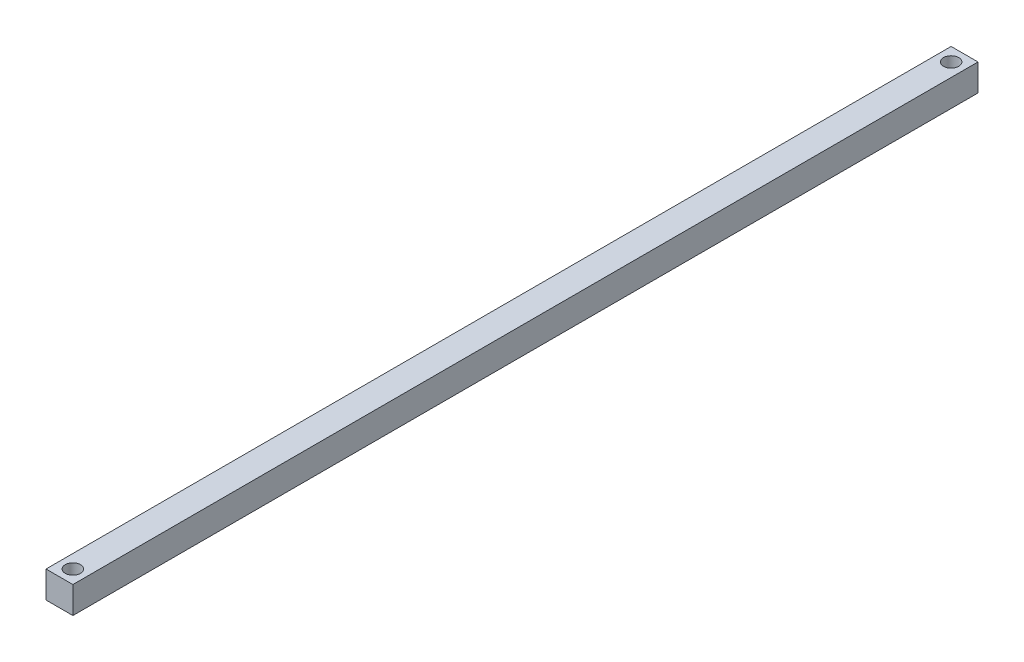
ISO-10303-21;
HEADER;
FILE_DESCRIPTION(('STEP AP214'),'2;1');
FILE_NAME('part.step','',(''),(''),'','','');
FILE_SCHEMA(('AUTOMOTIVE_DESIGN { 1 0 10303 214 1 1 1 1 }'));
ENDSEC;
DATA;
#1=APPLICATION_CONTEXT('core data for automotive mechanical design processes');
#2=APPLICATION_PROTOCOL_DEFINITION('international standard','automotive_design',2000,#1);
#3=PRODUCT_CONTEXT('',#1,'mechanical');
#4=PRODUCT('Part','Part','',(#3));
#5=PRODUCT_RELATED_PRODUCT_CATEGORY('part','',(#4));
#6=PRODUCT_DEFINITION_FORMATION('','',#4);
#7=PRODUCT_DEFINITION_CONTEXT('part definition',#1,'design');
#8=PRODUCT_DEFINITION('design','',#6,#7);
#9=PRODUCT_DEFINITION_SHAPE('','',#8);
#10=(LENGTH_UNIT() NAMED_UNIT(*) SI_UNIT(.MILLI.,.METRE.));
#11=(NAMED_UNIT(*) PLANE_ANGLE_UNIT() SI_UNIT($,.RADIAN.));
#12=(NAMED_UNIT(*) SI_UNIT($,.STERADIAN.) SOLID_ANGLE_UNIT());
#13=UNCERTAINTY_MEASURE_WITH_UNIT(LENGTH_MEASURE(1.E-05),#10,'distance_accuracy_value','');
#14=(GEOMETRIC_REPRESENTATION_CONTEXT(3) GLOBAL_UNCERTAINTY_ASSIGNED_CONTEXT((#13)) GLOBAL_UNIT_ASSIGNED_CONTEXT((#10,
#11,#12)) REPRESENTATION_CONTEXT('',''));
#15=CARTESIAN_POINT('',(0.,0.,0.));
#16=DIRECTION('',(0.,0.,1.));
#17=DIRECTION('',(1.,0.,0.));
#18=AXIS2_PLACEMENT_3D('',#15,#16,#17);
#19=CARTESIAN_POINT('',(7.5,-7.5,252.5));
#20=DIRECTION('',(-1.,0.,0.));
#21=DIRECTION('',(0.,0.,1.));
#22=AXIS2_PLACEMENT_3D('',#19,#20,#21);
#23=PLANE('',#22);
#24=DIRECTION('',(0.,1.,0.));
#25=VECTOR('',#24,1.);
#26=CARTESIAN_POINT('',(7.5,-7.5,-252.5));
#27=LINE('',#26,#25);
#28=CARTESIAN_POINT('',(7.5,-7.5,-252.5));
#29=VERTEX_POINT('',#28);
#30=CARTESIAN_POINT('',(7.5,7.5,-252.5));
#31=VERTEX_POINT('',#30);
#32=EDGE_CURVE('E99',#29,#31,#27,.T.);
#33=ORIENTED_EDGE('',*,*,#32,.T.);
#34=DIRECTION('',(0.,0.,-1.));
#35=VECTOR('',#34,1.);
#36=CARTESIAN_POINT('',(7.5,7.5,252.5));
#37=LINE('',#36,#35);
#38=CARTESIAN_POINT('',(7.5,7.5,252.5));
#39=VERTEX_POINT('',#38);
#40=EDGE_CURVE('E11',#39,#31,#37,.T.);
#41=ORIENTED_EDGE('',*,*,#40,.F.);
#42=DIRECTION('',(0.,1.,0.));
#43=VECTOR('',#42,1.);
#44=CARTESIAN_POINT('',(7.5,-7.5,252.5));
#45=LINE('',#44,#43);
#46=CARTESIAN_POINT('',(7.5,-7.5,252.5));
#47=VERTEX_POINT('',#46);
#48=EDGE_CURVE('E87',#47,#39,#45,.T.);
#49=ORIENTED_EDGE('',*,*,#48,.F.);
#50=DIRECTION('',(0.,0.,-1.));
#51=VECTOR('',#50,1.);
#52=CARTESIAN_POINT('',(7.5,-7.5,252.5));
#53=LINE('',#52,#51);
#54=EDGE_CURVE('E95',#47,#29,#53,.T.);
#55=ORIENTED_EDGE('',*,*,#54,.T.);
#56=EDGE_LOOP('',(#33,#41,#49,#55));
#57=FACE_BOUND('',#56,.T.);
#58=ADVANCED_FACE('F36',(#57),#23,.F.);
#59=CARTESIAN_POINT('',(-7.5,7.5,252.5));
#60=DIRECTION('',(0.,-1.,0.));
#61=DIRECTION('',(0.,0.,-1.));
#62=AXIS2_PLACEMENT_3D('',#59,#60,#61);
#63=PLANE('',#62);
#64=CARTESIAN_POINT('',(0.,7.5,245.));
#65=DIRECTION('',(0.,-1.,0.));
#66=DIRECTION('',(0.,0.,-1.));
#67=AXIS2_PLACEMENT_3D('',#64,#65,#66);
#68=CIRCLE('',#67,4.25000000000001);
#69=CARTESIAN_POINT('',(0.,7.5,240.75));
#70=VERTEX_POINT('',#69);
#71=EDGE_CURVE('E124',#70,#70,#68,.T.);
#72=ORIENTED_EDGE('',*,*,#71,.T.);
#73=EDGE_LOOP('',(#72));
#74=FACE_BOUND('',#73,.T.);
#75=CARTESIAN_POINT('',(0.,7.5,-245.));
#76=DIRECTION('',(0.,-1.,0.));
#77=DIRECTION('',(0.,0.,-1.));
#78=AXIS2_PLACEMENT_3D('',#75,#76,#77);
#79=CIRCLE('',#78,4.25000000000001);
#80=CARTESIAN_POINT('',(0.,7.5,-249.25));
#81=VERTEX_POINT('',#80);
#82=EDGE_CURVE('E102',#81,#81,#79,.T.);
#83=ORIENTED_EDGE('',*,*,#82,.T.);
#84=EDGE_LOOP('',(#83));
#85=FACE_BOUND('',#84,.T.);
#86=DIRECTION('',(-1.,0.,0.));
#87=VECTOR('',#86,1.);
#88=CARTESIAN_POINT('',(-7.5,7.5,-252.5));
#89=LINE('',#88,#87);
#90=CARTESIAN_POINT('',(-7.5,7.5,-252.5));
#91=VERTEX_POINT('',#90);
#92=EDGE_CURVE('E91',#31,#91,#89,.T.);
#93=ORIENTED_EDGE('',*,*,#92,.T.);
#94=DIRECTION('',(0.,0.,-1.));
#95=VECTOR('',#94,1.);
#96=CARTESIAN_POINT('',(-7.5,7.5,252.5));
#97=LINE('',#96,#95);
#98=CARTESIAN_POINT('',(-7.5,7.5,252.5));
#99=VERTEX_POINT('',#98);
#100=EDGE_CURVE('E44',#99,#91,#97,.T.);
#101=ORIENTED_EDGE('',*,*,#100,.F.);
#102=DIRECTION('',(-1.,0.,0.));
#103=VECTOR('',#102,1.);
#104=CARTESIAN_POINT('',(-7.5,7.5,252.5));
#105=LINE('',#104,#103);
#106=EDGE_CURVE('E82',#39,#99,#105,.T.);
#107=ORIENTED_EDGE('',*,*,#106,.F.);
#108=ORIENTED_EDGE('',*,*,#40,.T.);
#109=EDGE_LOOP('',(#93,#101,#107,#108));
#110=FACE_BOUND('',#109,.T.);
#111=ADVANCED_FACE('F90',(#74,#85,#110),#63,.F.);
#112=CARTESIAN_POINT('',(-7.5,-7.5,252.5));
#113=DIRECTION('',(1.,0.,0.));
#114=DIRECTION('',(0.,0.,-1.));
#115=AXIS2_PLACEMENT_3D('',#112,#113,#114);
#116=PLANE('',#115);
#117=DIRECTION('',(0.,-1.,0.));
#118=VECTOR('',#117,1.);
#119=CARTESIAN_POINT('',(-7.5,-7.5,-252.5));
#120=LINE('',#119,#118);
#121=CARTESIAN_POINT('',(-7.5,-7.5,-252.5));
#122=VERTEX_POINT('',#121);
#123=EDGE_CURVE('E69',#91,#122,#120,.T.);
#124=ORIENTED_EDGE('',*,*,#123,.T.);
#125=DIRECTION('',(0.,0.,-1.));
#126=VECTOR('',#125,1.);
#127=CARTESIAN_POINT('',(-7.5,-7.5,252.5));
#128=LINE('',#127,#126);
#129=CARTESIAN_POINT('',(-7.5,-7.5,252.5));
#130=VERTEX_POINT('',#129);
#131=EDGE_CURVE('E92',#130,#122,#128,.T.);
#132=ORIENTED_EDGE('',*,*,#131,.F.);
#133=DIRECTION('',(0.,-1.,0.));
#134=VECTOR('',#133,1.);
#135=CARTESIAN_POINT('',(-7.5,-7.5,252.5));
#136=LINE('',#135,#134);
#137=EDGE_CURVE('E85',#99,#130,#136,.T.);
#138=ORIENTED_EDGE('',*,*,#137,.F.);
#139=ORIENTED_EDGE('',*,*,#100,.T.);
#140=EDGE_LOOP('',(#124,#132,#138,#139));
#141=FACE_BOUND('',#140,.T.);
#142=ADVANCED_FACE('F93',(#141),#116,.F.);
#143=CARTESIAN_POINT('',(-7.5,-7.5,252.5));
#144=DIRECTION('',(0.,1.,0.));
#145=DIRECTION('',(0.,0.,1.));
#146=AXIS2_PLACEMENT_3D('',#143,#144,#145);
#147=PLANE('',#146);
#148=CARTESIAN_POINT('',(0.,-7.5,245.));
#149=DIRECTION('',(0.,-1.,0.));
#150=DIRECTION('',(0.,0.,-1.));
#151=AXIS2_PLACEMENT_3D('',#148,#149,#150);
#152=CIRCLE('',#151,7.00000000000001);
#153=CARTESIAN_POINT('',(0.,-7.5,238.));
#154=VERTEX_POINT('',#153);
#155=EDGE_CURVE('E133',#154,#154,#152,.T.);
#156=ORIENTED_EDGE('',*,*,#155,.F.);
#157=EDGE_LOOP('',(#156));
#158=FACE_BOUND('',#157,.T.);
#159=CARTESIAN_POINT('',(0.,-7.5,-245.));
#160=DIRECTION('',(0.,-1.,0.));
#161=DIRECTION('',(0.,0.,-1.));
#162=AXIS2_PLACEMENT_3D('',#159,#160,#161);
#163=CIRCLE('',#162,7.00000000000001);
#164=CARTESIAN_POINT('',(0.,-7.5,-252.));
#165=VERTEX_POINT('',#164);
#166=EDGE_CURVE('E121',#165,#165,#163,.T.);
#167=ORIENTED_EDGE('',*,*,#166,.F.);
#168=EDGE_LOOP('',(#167));
#169=FACE_BOUND('',#168,.T.);
#170=DIRECTION('',(1.,0.,0.));
#171=VECTOR('',#170,1.);
#172=CARTESIAN_POINT('',(-7.5,-7.5,-252.5));
#173=LINE('',#172,#171);
#174=EDGE_CURVE('E75',#122,#29,#173,.T.);
#175=ORIENTED_EDGE('',*,*,#174,.T.);
#176=ORIENTED_EDGE('',*,*,#54,.F.);
#177=DIRECTION('',(1.,0.,0.));
#178=VECTOR('',#177,1.);
#179=CARTESIAN_POINT('',(-7.5,-7.5,252.5));
#180=LINE('',#179,#178);
#181=EDGE_CURVE('E52',#130,#47,#180,.T.);
#182=ORIENTED_EDGE('',*,*,#181,.F.);
#183=ORIENTED_EDGE('',*,*,#131,.T.);
#184=EDGE_LOOP('',(#175,#176,#182,#183));
#185=FACE_BOUND('',#184,.T.);
#186=ADVANCED_FACE('F107',(#158,#169,#185),#147,.F.);
#187=CARTESIAN_POINT('',(0.,0.,252.5));
#188=DIRECTION('',(0.,0.,-1.));
#189=DIRECTION('',(-1.,0.,0.));
#190=AXIS2_PLACEMENT_3D('',#187,#188,#189);
#191=PLANE('',#190);
#192=ORIENTED_EDGE('',*,*,#48,.T.);
#193=ORIENTED_EDGE('',*,*,#106,.T.);
#194=ORIENTED_EDGE('',*,*,#137,.T.);
#195=ORIENTED_EDGE('',*,*,#181,.T.);
#196=EDGE_LOOP('',(#192,#193,#194,#195));
#197=FACE_BOUND('',#196,.T.);
#198=ADVANCED_FACE('F83',(#197),#191,.F.);
#199=CARTESIAN_POINT('',(0.,0.,-252.5));
#200=DIRECTION('',(0.,0.,-1.));
#201=DIRECTION('',(-1.,0.,0.));
#202=AXIS2_PLACEMENT_3D('',#199,#200,#201);
#203=PLANE('',#202);
#204=ORIENTED_EDGE('',*,*,#32,.F.);
#205=ORIENTED_EDGE('',*,*,#174,.F.);
#206=ORIENTED_EDGE('',*,*,#123,.F.);
#207=ORIENTED_EDGE('',*,*,#92,.F.);
#208=EDGE_LOOP('',(#204,#205,#206,#207));
#209=FACE_BOUND('',#208,.T.);
#210=ADVANCED_FACE('F110',(#209),#203,.T.);
#211=CARTESIAN_POINT('',(0.,-7.5,-245.));
#212=DIRECTION('',(0.,-1.,0.));
#213=DIRECTION('',(0.,0.,-1.));
#214=AXIS2_PLACEMENT_3D('',#211,#212,#213);
#215=CYLINDRICAL_SURFACE('',#214,4.25000000000001);
#216=ORIENTED_EDGE('',*,*,#82,.F.);
#217=EDGE_LOOP('',(#216));
#218=FACE_BOUND('',#217,.T.);
#219=CARTESIAN_POINT('',(0.,0.5,-245.));
#220=DIRECTION('',(0.,-1.,0.));
#221=DIRECTION('',(0.,0.,-1.));
#222=AXIS2_PLACEMENT_3D('',#219,#220,#221);
#223=CIRCLE('',#222,4.25000000000001);
#224=CARTESIAN_POINT('',(0.,0.5,-249.25));
#225=VERTEX_POINT('',#224);
#226=EDGE_CURVE('E115',#225,#225,#223,.T.);
#227=ORIENTED_EDGE('',*,*,#226,.T.);
#228=EDGE_LOOP('',(#227));
#229=FACE_BOUND('',#228,.T.);
#230=ADVANCED_FACE('F157',(#218,#229),#215,.F.);
#231=CARTESIAN_POINT('',(4.25000000000001,0.5,-245.));
#232=DIRECTION('',(0.,1.,0.));
#233=DIRECTION('',(0.,0.,1.));
#234=AXIS2_PLACEMENT_3D('',#231,#232,#233);
#235=PLANE('',#234);
#236=ORIENTED_EDGE('',*,*,#226,.F.);
#237=EDGE_LOOP('',(#236));
#238=FACE_BOUND('',#237,.T.);
#239=CARTESIAN_POINT('',(0.,0.5,-245.));
#240=DIRECTION('',(0.,-1.,0.));
#241=DIRECTION('',(0.,0.,-1.));
#242=AXIS2_PLACEMENT_3D('',#239,#240,#241);
#243=CIRCLE('',#242,7.00000000000001);
#244=CARTESIAN_POINT('',(0.,0.5,-252.));
#245=VERTEX_POINT('',#244);
#246=EDGE_CURVE('E118',#245,#245,#243,.T.);
#247=ORIENTED_EDGE('',*,*,#246,.T.);
#248=EDGE_LOOP('',(#247));
#249=FACE_BOUND('',#248,.T.);
#250=ADVANCED_FACE('F147',(#238,#249),#235,.F.);
#251=CARTESIAN_POINT('',(0.,-7.5,-245.));
#252=DIRECTION('',(0.,-1.,0.));
#253=DIRECTION('',(0.,0.,-1.));
#254=AXIS2_PLACEMENT_3D('',#251,#252,#253);
#255=CYLINDRICAL_SURFACE('',#254,7.00000000000001);
#256=ORIENTED_EDGE('',*,*,#246,.F.);
#257=EDGE_LOOP('',(#256));
#258=FACE_BOUND('',#257,.T.);
#259=ORIENTED_EDGE('',*,*,#166,.T.);
#260=EDGE_LOOP('',(#259));
#261=FACE_BOUND('',#260,.T.);
#262=ADVANCED_FACE('F144',(#258,#261),#255,.F.);
#263=CARTESIAN_POINT('',(0.,-7.5,245.));
#264=DIRECTION('',(0.,-1.,0.));
#265=DIRECTION('',(0.,0.,-1.));
#266=AXIS2_PLACEMENT_3D('',#263,#264,#265);
#267=CYLINDRICAL_SURFACE('',#266,4.25000000000001);
#268=ORIENTED_EDGE('',*,*,#71,.F.);
#269=EDGE_LOOP('',(#268));
#270=FACE_BOUND('',#269,.T.);
#271=CARTESIAN_POINT('',(0.,0.5,245.));
#272=DIRECTION('',(0.,-1.,0.));
#273=DIRECTION('',(0.,0.,-1.));
#274=AXIS2_PLACEMENT_3D('',#271,#272,#273);
#275=CIRCLE('',#274,4.25000000000001);
#276=CARTESIAN_POINT('',(0.,0.5,240.75));
#277=VERTEX_POINT('',#276);
#278=EDGE_CURVE('E127',#277,#277,#275,.T.);
#279=ORIENTED_EDGE('',*,*,#278,.T.);
#280=EDGE_LOOP('',(#279));
#281=FACE_BOUND('',#280,.T.);
#282=ADVANCED_FACE('F146',(#270,#281),#267,.F.);
#283=CARTESIAN_POINT('',(4.25000000000001,0.5,245.));
#284=DIRECTION('',(0.,1.,0.));
#285=DIRECTION('',(0.,0.,1.));
#286=AXIS2_PLACEMENT_3D('',#283,#284,#285);
#287=PLANE('',#286);
#288=ORIENTED_EDGE('',*,*,#278,.F.);
#289=EDGE_LOOP('',(#288));
#290=FACE_BOUND('',#289,.T.);
#291=CARTESIAN_POINT('',(0.,0.5,245.));
#292=DIRECTION('',(0.,-1.,0.));
#293=DIRECTION('',(0.,0.,-1.));
#294=AXIS2_PLACEMENT_3D('',#291,#292,#293);
#295=CIRCLE('',#294,7.00000000000001);
#296=CARTESIAN_POINT('',(0.,0.5,238.));
#297=VERTEX_POINT('',#296);
#298=EDGE_CURVE('E130',#297,#297,#295,.T.);
#299=ORIENTED_EDGE('',*,*,#298,.T.);
#300=EDGE_LOOP('',(#299));
#301=FACE_BOUND('',#300,.T.);
#302=ADVANCED_FACE('F154',(#290,#301),#287,.F.);
#303=CARTESIAN_POINT('',(0.,-7.5,245.));
#304=DIRECTION('',(0.,-1.,0.));
#305=DIRECTION('',(0.,0.,-1.));
#306=AXIS2_PLACEMENT_3D('',#303,#304,#305);
#307=CYLINDRICAL_SURFACE('',#306,7.00000000000001);
#308=ORIENTED_EDGE('',*,*,#298,.F.);
#309=EDGE_LOOP('',(#308));
#310=FACE_BOUND('',#309,.T.);
#311=ORIENTED_EDGE('',*,*,#155,.T.);
#312=EDGE_LOOP('',(#311));
#313=FACE_BOUND('',#312,.T.);
#314=ADVANCED_FACE('F137',(#310,#313),#307,.F.);
#315=CLOSED_SHELL('',(#58,#111,#142,#186,#198,#210,#230,#250,#262,#282,#302,#314));
#316=MANIFOLD_SOLID_BREP('B2',#315);
#317=ADVANCED_BREP_SHAPE_REPRESENTATION('',(#18,#316),#14);
#318=SHAPE_DEFINITION_REPRESENTATION(#9,#317);
ENDSEC;
END-ISO-10303-21;
